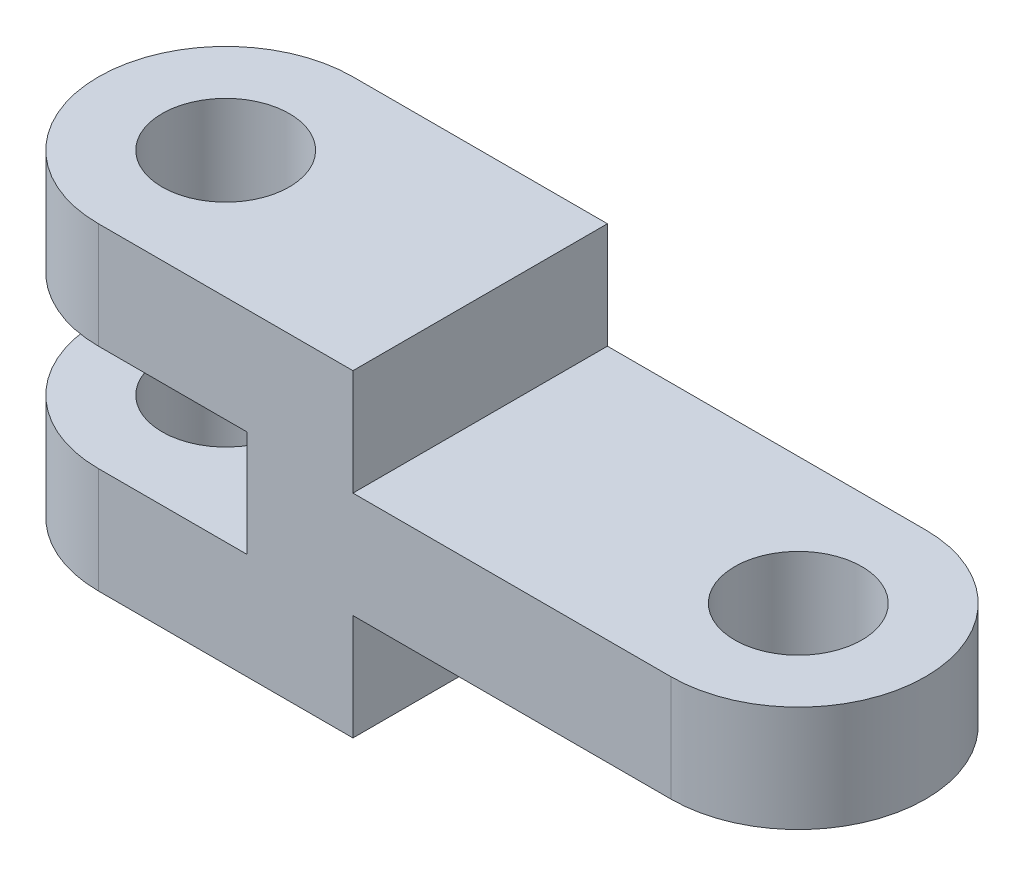
ISO-10303-21;
HEADER;
FILE_DESCRIPTION(('STEP AP214'),'2;1');
FILE_NAME('part.step','',(''),(''),'','','');
FILE_SCHEMA(('AUTOMOTIVE_DESIGN { 1 0 10303 214 1 1 1 1 }'));
ENDSEC;
DATA;
#1=APPLICATION_CONTEXT('core data for automotive mechanical design processes');
#2=APPLICATION_PROTOCOL_DEFINITION('international standard','automotive_design',2000,#1);
#3=PRODUCT_CONTEXT('',#1,'mechanical');
#4=PRODUCT('Part','Part','',(#3));
#5=PRODUCT_RELATED_PRODUCT_CATEGORY('part','',(#4));
#6=PRODUCT_DEFINITION_FORMATION('','',#4);
#7=PRODUCT_DEFINITION_CONTEXT('part definition',#1,'design');
#8=PRODUCT_DEFINITION('design','',#6,#7);
#9=PRODUCT_DEFINITION_SHAPE('','',#8);
#10=(LENGTH_UNIT() NAMED_UNIT(*) SI_UNIT(.MILLI.,.METRE.));
#11=(NAMED_UNIT(*) PLANE_ANGLE_UNIT() SI_UNIT($,.RADIAN.));
#12=(NAMED_UNIT(*) SI_UNIT($,.STERADIAN.) SOLID_ANGLE_UNIT());
#13=UNCERTAINTY_MEASURE_WITH_UNIT(LENGTH_MEASURE(1.E-05),#10,'distance_accuracy_value','');
#14=(GEOMETRIC_REPRESENTATION_CONTEXT(3) GLOBAL_UNCERTAINTY_ASSIGNED_CONTEXT((#13)) GLOBAL_UNIT_ASSIGNED_CONTEXT((#10,
#11,#12)) REPRESENTATION_CONTEXT('',''));
#15=CARTESIAN_POINT('',(0.,0.,0.));
#16=DIRECTION('',(0.,0.,1.));
#17=DIRECTION('',(1.,0.,0.));
#18=AXIS2_PLACEMENT_3D('',#15,#16,#17);
#19=CARTESIAN_POINT('',(35.,-25.,60.));
#20=DIRECTION('',(0.,1.,0.));
#21=DIRECTION('',(0.,0.,1.));
#22=AXIS2_PLACEMENT_3D('',#19,#20,#21);
#23=PLANE('',#22);
#24=CARTESIAN_POINT('',(0.,-25.,30.));
#25=DIRECTION('',(0.,1.,0.));
#26=DIRECTION('',(0.,0.,1.));
#27=AXIS2_PLACEMENT_3D('',#24,#25,#26);
#28=CIRCLE('',#27,15.);
#29=CARTESIAN_POINT('',(0.,-25.,45.));
#30=VERTEX_POINT('',#29);
#31=EDGE_CURVE('E249',#30,#30,#28,.T.);
#32=ORIENTED_EDGE('',*,*,#31,.T.);
#33=EDGE_LOOP('',(#32));
#34=FACE_BOUND('',#33,.T.);
#35=DIRECTION('',(1.,0.,0.));
#36=VECTOR('',#35,1.);
#37=CARTESIAN_POINT('',(35.,-25.,0.));
#38=LINE('',#37,#36);
#39=CARTESIAN_POINT('',(0.,-25.,0.));
#40=VERTEX_POINT('',#39);
#41=CARTESIAN_POINT('',(35.,-25.,0.));
#42=VERTEX_POINT('',#41);
#43=EDGE_CURVE('E159',#40,#42,#38,.T.);
#44=ORIENTED_EDGE('',*,*,#43,.T.);
#45=DIRECTION('',(0.,0.,-1.));
#46=VECTOR('',#45,1.);
#47=CARTESIAN_POINT('',(35.,-25.,60.));
#48=LINE('',#47,#46);
#49=CARTESIAN_POINT('',(35.,-25.,60.));
#50=VERTEX_POINT('',#49);
#51=EDGE_CURVE('E11',#50,#42,#48,.T.);
#52=ORIENTED_EDGE('',*,*,#51,.F.);
#53=DIRECTION('',(1.,0.,0.));
#54=VECTOR('',#53,1.);
#55=CARTESIAN_POINT('',(35.,-25.,60.));
#56=LINE('',#55,#54);
#57=CARTESIAN_POINT('',(0.,-25.,60.));
#58=VERTEX_POINT('',#57);
#59=EDGE_CURVE('E106',#58,#50,#56,.T.);
#60=ORIENTED_EDGE('',*,*,#59,.F.);
#61=CARTESIAN_POINT('',(0.,-25.,30.));
#62=DIRECTION('',(0.,1.,0.));
#63=DIRECTION('',(0.,0.,1.));
#64=AXIS2_PLACEMENT_3D('',#61,#62,#63);
#65=CIRCLE('',#64,30.);
#66=EDGE_CURVE('E160',#40,#58,#65,.T.);
#67=ORIENTED_EDGE('',*,*,#66,.F.);
#68=EDGE_LOOP('',(#44,#52,#60,#67));
#69=FACE_BOUND('',#68,.T.);
#70=ADVANCED_FACE('F41',(#34,#69),#23,.F.);
#71=CARTESIAN_POINT('',(35.,-50.,60.));
#72=DIRECTION('',(1.,0.,0.));
#73=DIRECTION('',(0.,1.,0.));
#74=AXIS2_PLACEMENT_3D('',#71,#72,#73);
#75=PLANE('',#74);
#76=DIRECTION('',(0.,-1.,0.));
#77=VECTOR('',#76,1.);
#78=CARTESIAN_POINT('',(35.,-50.,0.));
#79=LINE('',#78,#77);
#80=CARTESIAN_POINT('',(35.,-50.,0.));
#81=VERTEX_POINT('',#80);
#82=EDGE_CURVE('E162',#42,#81,#79,.T.);
#83=ORIENTED_EDGE('',*,*,#82,.T.);
#84=DIRECTION('',(0.,0.,-1.));
#85=VECTOR('',#84,1.);
#86=CARTESIAN_POINT('',(35.,-50.,60.));
#87=LINE('',#86,#85);
#88=CARTESIAN_POINT('',(35.,-50.,60.));
#89=VERTEX_POINT('',#88);
#90=EDGE_CURVE('E49',#89,#81,#87,.T.);
#91=ORIENTED_EDGE('',*,*,#90,.F.);
#92=DIRECTION('',(0.,-1.,0.));
#93=VECTOR('',#92,1.);
#94=CARTESIAN_POINT('',(35.,-50.,60.));
#95=LINE('',#94,#93);
#96=EDGE_CURVE('E228',#50,#89,#95,.T.);
#97=ORIENTED_EDGE('',*,*,#96,.F.);
#98=ORIENTED_EDGE('',*,*,#51,.T.);
#99=EDGE_LOOP('',(#83,#91,#97,#98));
#100=FACE_BOUND('',#99,.T.);
#101=ADVANCED_FACE('F284',(#100),#75,.F.);
#102=CARTESIAN_POINT('',(0.,-50.,60.));
#103=DIRECTION('',(0.,-1.,0.));
#104=DIRECTION('',(1.,0.,0.));
#105=AXIS2_PLACEMENT_3D('',#102,#103,#104);
#106=PLANE('',#105);
#107=CARTESIAN_POINT('',(0.,-50.,30.));
#108=DIRECTION('',(0.,-1.,0.));
#109=DIRECTION('',(1.,0.,0.));
#110=AXIS2_PLACEMENT_3D('',#107,#108,#109);
#111=CIRCLE('',#110,15.);
#112=CARTESIAN_POINT('',(15.,-50.,30.));
#113=VERTEX_POINT('',#112);
#114=EDGE_CURVE('E251',#113,#113,#111,.T.);
#115=ORIENTED_EDGE('',*,*,#114,.T.);
#116=EDGE_LOOP('',(#115));
#117=FACE_BOUND('',#116,.T.);
#118=DIRECTION('',(-1.,0.,0.));
#119=VECTOR('',#118,1.);
#120=CARTESIAN_POINT('',(0.,-50.,0.));
#121=LINE('',#120,#119);
#122=CARTESIAN_POINT('',(0.,-50.,0.));
#123=VERTEX_POINT('',#122);
#124=EDGE_CURVE('E164',#81,#123,#121,.T.);
#125=ORIENTED_EDGE('',*,*,#124,.T.);
#126=CARTESIAN_POINT('',(0.,-50.,30.));
#127=DIRECTION('',(0.,1.,0.));
#128=DIRECTION('',(-1.,0.,0.));
#129=AXIS2_PLACEMENT_3D('',#126,#127,#128);
#130=CIRCLE('',#129,30.);
#131=CARTESIAN_POINT('',(0.,-50.,60.));
#132=VERTEX_POINT('',#131);
#133=EDGE_CURVE('E210',#123,#132,#130,.T.);
#134=ORIENTED_EDGE('',*,*,#133,.T.);
#135=DIRECTION('',(-1.,0.,0.));
#136=VECTOR('',#135,1.);
#137=CARTESIAN_POINT('',(0.,-50.,60.));
#138=LINE('',#137,#136);
#139=EDGE_CURVE('E195',#89,#132,#138,.T.);
#140=ORIENTED_EDGE('',*,*,#139,.F.);
#141=ORIENTED_EDGE('',*,*,#90,.T.);
#142=EDGE_LOOP('',(#125,#134,#140,#141));
#143=FACE_BOUND('',#142,.T.);
#144=ADVANCED_FACE('F192',(#117,#143),#106,.F.);
#145=CARTESIAN_POINT('',(60.,-75.,60.));
#146=DIRECTION('',(0.,1.,0.));
#147=DIRECTION('',(-1.,0.,0.));
#148=AXIS2_PLACEMENT_3D('',#145,#146,#147);
#149=PLANE('',#148);
#150=CARTESIAN_POINT('',(0.,-75.,30.));
#151=DIRECTION('',(0.,1.,0.));
#152=DIRECTION('',(0.,0.,1.));
#153=AXIS2_PLACEMENT_3D('',#150,#151,#152);
#154=CIRCLE('',#153,15.);
#155=CARTESIAN_POINT('',(0.,-75.,45.));
#156=VERTEX_POINT('',#155);
#157=EDGE_CURVE('E256',#156,#156,#154,.T.);
#158=ORIENTED_EDGE('',*,*,#157,.T.);
#159=EDGE_LOOP('',(#158));
#160=FACE_BOUND('',#159,.T.);
#161=DIRECTION('',(1.,0.,0.));
#162=VECTOR('',#161,1.);
#163=CARTESIAN_POINT('',(60.,-75.,0.));
#164=LINE('',#163,#162);
#165=CARTESIAN_POINT('',(0.,-75.,0.));
#166=VERTEX_POINT('',#165);
#167=CARTESIAN_POINT('',(60.,-75.,0.));
#168=VERTEX_POINT('',#167);
#169=EDGE_CURVE('E169',#166,#168,#164,.T.);
#170=ORIENTED_EDGE('',*,*,#169,.T.);
#171=DIRECTION('',(0.,0.,-1.));
#172=VECTOR('',#171,1.);
#173=CARTESIAN_POINT('',(60.,-75.,60.));
#174=LINE('',#173,#172);
#175=CARTESIAN_POINT('',(60.,-75.,60.));
#176=VERTEX_POINT('',#175);
#177=EDGE_CURVE('E185',#176,#168,#174,.T.);
#178=ORIENTED_EDGE('',*,*,#177,.F.);
#179=DIRECTION('',(1.,0.,0.));
#180=VECTOR('',#179,1.);
#181=CARTESIAN_POINT('',(60.,-75.,60.));
#182=LINE('',#181,#180);
#183=CARTESIAN_POINT('',(0.,-75.,60.));
#184=VERTEX_POINT('',#183);
#185=EDGE_CURVE('E232',#184,#176,#182,.T.);
#186=ORIENTED_EDGE('',*,*,#185,.F.);
#187=CARTESIAN_POINT('',(0.,-75.,30.));
#188=DIRECTION('',(0.,1.,0.));
#189=DIRECTION('',(-1.,0.,0.));
#190=AXIS2_PLACEMENT_3D('',#187,#188,#189);
#191=CIRCLE('',#190,30.);
#192=EDGE_CURVE('E213',#166,#184,#191,.T.);
#193=ORIENTED_EDGE('',*,*,#192,.F.);
#194=EDGE_LOOP('',(#170,#178,#186,#193));
#195=FACE_BOUND('',#194,.T.);
#196=ADVANCED_FACE('F327',(#160,#195),#149,.F.);
#197=CARTESIAN_POINT('',(60.,-50.,60.));
#198=DIRECTION('',(-1.,0.,0.));
#199=DIRECTION('',(0.,0.,1.));
#200=AXIS2_PLACEMENT_3D('',#197,#198,#199);
#201=PLANE('',#200);
#202=DIRECTION('',(0.,1.,0.));
#203=VECTOR('',#202,1.);
#204=CARTESIAN_POINT('',(60.,-50.,0.));
#205=LINE('',#204,#203);
#206=CARTESIAN_POINT('',(60.,-50.,0.));
#207=VERTEX_POINT('',#206);
#208=EDGE_CURVE('E171',#168,#207,#205,.T.);
#209=ORIENTED_EDGE('',*,*,#208,.T.);
#210=DIRECTION('',(0.,0.,-1.));
#211=VECTOR('',#210,1.);
#212=CARTESIAN_POINT('',(60.,-50.,60.));
#213=LINE('',#212,#211);
#214=CARTESIAN_POINT('',(60.,-50.,60.));
#215=VERTEX_POINT('',#214);
#216=EDGE_CURVE('E148',#215,#207,#213,.T.);
#217=ORIENTED_EDGE('',*,*,#216,.F.);
#218=DIRECTION('',(0.,1.,0.));
#219=VECTOR('',#218,1.);
#220=CARTESIAN_POINT('',(60.,-50.,60.));
#221=LINE('',#220,#219);
#222=EDGE_CURVE('E234',#176,#215,#221,.T.);
#223=ORIENTED_EDGE('',*,*,#222,.F.);
#224=ORIENTED_EDGE('',*,*,#177,.T.);
#225=EDGE_LOOP('',(#209,#217,#223,#224));
#226=FACE_BOUND('',#225,.T.);
#227=ADVANCED_FACE('F280',(#226),#201,.F.);
#228=CARTESIAN_POINT('',(135.,-50.,60.));
#229=DIRECTION('',(0.,1.,0.));
#230=DIRECTION('',(-1.,0.,0.));
#231=AXIS2_PLACEMENT_3D('',#228,#229,#230);
#232=PLANE('',#231);
#233=CARTESIAN_POINT('',(135.,-50.,30.));
#234=DIRECTION('',(0.,1.,0.));
#235=DIRECTION('',(-1.,0.,0.));
#236=AXIS2_PLACEMENT_3D('',#233,#234,#235);
#237=CIRCLE('',#236,15.);
#238=CARTESIAN_POINT('',(120.,-50.,30.));
#239=VERTEX_POINT('',#238);
#240=EDGE_CURVE('E260',#239,#239,#237,.T.);
#241=ORIENTED_EDGE('',*,*,#240,.T.);
#242=EDGE_LOOP('',(#241));
#243=FACE_BOUND('',#242,.T.);
#244=DIRECTION('',(1.,0.,0.));
#245=VECTOR('',#244,1.);
#246=CARTESIAN_POINT('',(135.,-50.,0.));
#247=LINE('',#246,#245);
#248=CARTESIAN_POINT('',(135.,-50.,0.));
#249=VERTEX_POINT('',#248);
#250=EDGE_CURVE('E173',#207,#249,#247,.T.);
#251=ORIENTED_EDGE('',*,*,#250,.T.);
#252=CARTESIAN_POINT('',(135.,-50.,30.));
#253=DIRECTION('',(0.,1.,0.));
#254=DIRECTION('',(1.,0.,0.));
#255=AXIS2_PLACEMENT_3D('',#252,#253,#254);
#256=CIRCLE('',#255,30.);
#257=CARTESIAN_POINT('',(135.,-50.,60.));
#258=VERTEX_POINT('',#257);
#259=EDGE_CURVE('E214',#258,#249,#256,.T.);
#260=ORIENTED_EDGE('',*,*,#259,.F.);
#261=DIRECTION('',(1.,0.,0.));
#262=VECTOR('',#261,1.);
#263=CARTESIAN_POINT('',(135.,-50.,60.));
#264=LINE('',#263,#262);
#265=EDGE_CURVE('E236',#215,#258,#264,.T.);
#266=ORIENTED_EDGE('',*,*,#265,.F.);
#267=ORIENTED_EDGE('',*,*,#216,.T.);
#268=EDGE_LOOP('',(#251,#260,#266,#267));
#269=FACE_BOUND('',#268,.T.);
#270=ADVANCED_FACE('F244',(#243,#269),#232,.F.);
#271=CARTESIAN_POINT('',(60.,-25.,60.));
#272=DIRECTION('',(0.,-1.,0.));
#273=DIRECTION('',(1.,0.,0.));
#274=AXIS2_PLACEMENT_3D('',#271,#272,#273);
#275=PLANE('',#274);
#276=CARTESIAN_POINT('',(135.,-25.,30.));
#277=DIRECTION('',(0.,1.,0.));
#278=DIRECTION('',(-1.,0.,0.));
#279=AXIS2_PLACEMENT_3D('',#276,#277,#278);
#280=CIRCLE('',#279,15.);
#281=CARTESIAN_POINT('',(120.,-25.,30.));
#282=VERTEX_POINT('',#281);
#283=EDGE_CURVE('E265',#282,#282,#280,.T.);
#284=ORIENTED_EDGE('',*,*,#283,.F.);
#285=EDGE_LOOP('',(#284));
#286=FACE_BOUND('',#285,.T.);
#287=DIRECTION('',(-1.,0.,0.));
#288=VECTOR('',#287,1.);
#289=CARTESIAN_POINT('',(60.,-25.,0.));
#290=LINE('',#289,#288);
#291=CARTESIAN_POINT('',(135.,-25.,0.));
#292=VERTEX_POINT('',#291);
#293=CARTESIAN_POINT('',(60.,-25.,0.));
#294=VERTEX_POINT('',#293);
#295=EDGE_CURVE('E147',#292,#294,#290,.T.);
#296=ORIENTED_EDGE('',*,*,#295,.T.);
#297=DIRECTION('',(0.,0.,-1.));
#298=VECTOR('',#297,1.);
#299=CARTESIAN_POINT('',(60.,-25.,60.));
#300=LINE('',#299,#298);
#301=CARTESIAN_POINT('',(60.,-25.,60.));
#302=VERTEX_POINT('',#301);
#303=EDGE_CURVE('E144',#302,#294,#300,.T.);
#304=ORIENTED_EDGE('',*,*,#303,.F.);
#305=DIRECTION('',(-1.,0.,0.));
#306=VECTOR('',#305,1.);
#307=CARTESIAN_POINT('',(60.,-25.,60.));
#308=LINE('',#307,#306);
#309=CARTESIAN_POINT('',(135.,-25.,60.));
#310=VERTEX_POINT('',#309);
#311=EDGE_CURVE('E133',#310,#302,#308,.T.);
#312=ORIENTED_EDGE('',*,*,#311,.F.);
#313=CARTESIAN_POINT('',(135.,-25.,30.));
#314=DIRECTION('',(0.,1.,0.));
#315=DIRECTION('',(1.,0.,0.));
#316=AXIS2_PLACEMENT_3D('',#313,#314,#315);
#317=CIRCLE('',#316,30.);
#318=EDGE_CURVE('E219',#310,#292,#317,.T.);
#319=ORIENTED_EDGE('',*,*,#318,.T.);
#320=EDGE_LOOP('',(#296,#304,#312,#319));
#321=FACE_BOUND('',#320,.T.);
#322=ADVANCED_FACE('F145',(#286,#321),#275,.F.);
#323=CARTESIAN_POINT('',(60.,0.,60.));
#324=DIRECTION('',(-1.,0.,0.));
#325=DIRECTION('',(0.,0.,1.));
#326=AXIS2_PLACEMENT_3D('',#323,#324,#325);
#327=PLANE('',#326);
#328=DIRECTION('',(0.,1.,0.));
#329=VECTOR('',#328,1.);
#330=CARTESIAN_POINT('',(60.,0.,0.));
#331=LINE('',#330,#329);
#332=CARTESIAN_POINT('',(60.,0.,0.));
#333=VERTEX_POINT('',#332);
#334=EDGE_CURVE('E90',#294,#333,#331,.T.);
#335=ORIENTED_EDGE('',*,*,#334,.T.);
#336=DIRECTION('',(0.,0.,-1.));
#337=VECTOR('',#336,1.);
#338=CARTESIAN_POINT('',(60.,0.,60.));
#339=LINE('',#338,#337);
#340=CARTESIAN_POINT('',(60.,0.,60.));
#341=VERTEX_POINT('',#340);
#342=EDGE_CURVE('E149',#341,#333,#339,.T.);
#343=ORIENTED_EDGE('',*,*,#342,.F.);
#344=DIRECTION('',(0.,1.,0.));
#345=VECTOR('',#344,1.);
#346=CARTESIAN_POINT('',(60.,0.,60.));
#347=LINE('',#346,#345);
#348=EDGE_CURVE('E137',#302,#341,#347,.T.);
#349=ORIENTED_EDGE('',*,*,#348,.F.);
#350=ORIENTED_EDGE('',*,*,#303,.T.);
#351=EDGE_LOOP('',(#335,#343,#349,#350));
#352=FACE_BOUND('',#351,.T.);
#353=ADVANCED_FACE('F151',(#352),#327,.F.);
#354=CARTESIAN_POINT('',(0.,0.,60.));
#355=DIRECTION('',(0.,-1.,0.));
#356=DIRECTION('',(0.,0.,-1.));
#357=AXIS2_PLACEMENT_3D('',#354,#355,#356);
#358=PLANE('',#357);
#359=CARTESIAN_POINT('',(0.,0.,30.));
#360=DIRECTION('',(0.,1.,0.));
#361=DIRECTION('',(0.,0.,1.));
#362=AXIS2_PLACEMENT_3D('',#359,#360,#361);
#363=CIRCLE('',#362,15.);
#364=CARTESIAN_POINT('',(0.,0.,45.));
#365=VERTEX_POINT('',#364);
#366=EDGE_CURVE('E257',#365,#365,#363,.T.);
#367=ORIENTED_EDGE('',*,*,#366,.F.);
#368=EDGE_LOOP('',(#367));
#369=FACE_BOUND('',#368,.T.);
#370=DIRECTION('',(-1.,0.,0.));
#371=VECTOR('',#370,1.);
#372=CARTESIAN_POINT('',(0.,0.,0.));
#373=LINE('',#372,#371);
#374=CARTESIAN_POINT('',(0.,0.,0.));
#375=VERTEX_POINT('',#374);
#376=EDGE_CURVE('E97',#333,#375,#373,.T.);
#377=ORIENTED_EDGE('',*,*,#376,.T.);
#378=CARTESIAN_POINT('',(0.,0.,30.));
#379=DIRECTION('',(0.,1.,0.));
#380=DIRECTION('',(0.,0.,1.));
#381=AXIS2_PLACEMENT_3D('',#378,#379,#380);
#382=CIRCLE('',#381,30.);
#383=CARTESIAN_POINT('',(0.,0.,60.));
#384=VERTEX_POINT('',#383);
#385=EDGE_CURVE('E216',#375,#384,#382,.T.);
#386=ORIENTED_EDGE('',*,*,#385,.T.);
#387=DIRECTION('',(-1.,0.,0.));
#388=VECTOR('',#387,1.);
#389=CARTESIAN_POINT('',(0.,0.,60.));
#390=LINE('',#389,#388);
#391=EDGE_CURVE('E57',#341,#384,#390,.T.);
#392=ORIENTED_EDGE('',*,*,#391,.F.);
#393=ORIENTED_EDGE('',*,*,#342,.T.);
#394=EDGE_LOOP('',(#377,#386,#392,#393));
#395=FACE_BOUND('',#394,.T.);
#396=ADVANCED_FACE('F278',(#369,#395),#358,.F.);
#397=CARTESIAN_POINT('',(0.,0.,60.));
#398=DIRECTION('',(0.,0.,-1.));
#399=DIRECTION('',(-1.,0.,0.));
#400=AXIS2_PLACEMENT_3D('',#397,#398,#399);
#401=PLANE('',#400);
#402=DIRECTION('',(0.,-1.,0.));
#403=VECTOR('',#402,1.);
#404=CARTESIAN_POINT('',(0.,-25.,60.));
#405=LINE('',#404,#403);
#406=EDGE_CURVE('E181',#384,#58,#405,.T.);
#407=ORIENTED_EDGE('',*,*,#406,.T.);
#408=ORIENTED_EDGE('',*,*,#59,.T.);
#409=ORIENTED_EDGE('',*,*,#96,.T.);
#410=ORIENTED_EDGE('',*,*,#139,.T.);
#411=DIRECTION('',(0.,-1.,0.));
#412=VECTOR('',#411,1.);
#413=CARTESIAN_POINT('',(0.,-75.,60.));
#414=LINE('',#413,#412);
#415=EDGE_CURVE('E212',#132,#184,#414,.T.);
#416=ORIENTED_EDGE('',*,*,#415,.T.);
#417=ORIENTED_EDGE('',*,*,#185,.T.);
#418=ORIENTED_EDGE('',*,*,#222,.T.);
#419=ORIENTED_EDGE('',*,*,#265,.T.);
#420=DIRECTION('',(0.,1.,0.));
#421=VECTOR('',#420,1.);
#422=CARTESIAN_POINT('',(135.,-25.,60.));
#423=LINE('',#422,#421);
#424=EDGE_CURVE('E139',#258,#310,#423,.T.);
#425=ORIENTED_EDGE('',*,*,#424,.T.);
#426=ORIENTED_EDGE('',*,*,#311,.T.);
#427=ORIENTED_EDGE('',*,*,#348,.T.);
#428=ORIENTED_EDGE('',*,*,#391,.T.);
#429=EDGE_LOOP('',(#407,#408,#409,#410,#416,#417,#418,#419,#425,#426,#427,#428));
#430=FACE_BOUND('',#429,.T.);
#431=ADVANCED_FACE('F135',(#430),#401,.F.);
#432=CARTESIAN_POINT('',(0.,0.,0.));
#433=DIRECTION('',(0.,0.,-1.));
#434=DIRECTION('',(-1.,0.,0.));
#435=AXIS2_PLACEMENT_3D('',#432,#433,#434);
#436=PLANE('',#435);
#437=DIRECTION('',(0.,-1.,0.));
#438=VECTOR('',#437,1.);
#439=CARTESIAN_POINT('',(0.,-25.,0.));
#440=LINE('',#439,#438);
#441=EDGE_CURVE('E156',#375,#40,#440,.T.);
#442=ORIENTED_EDGE('',*,*,#441,.F.);
#443=ORIENTED_EDGE('',*,*,#376,.F.);
#444=ORIENTED_EDGE('',*,*,#334,.F.);
#445=ORIENTED_EDGE('',*,*,#295,.F.);
#446=DIRECTION('',(0.,1.,0.));
#447=VECTOR('',#446,1.);
#448=CARTESIAN_POINT('',(135.,-25.,0.));
#449=LINE('',#448,#447);
#450=EDGE_CURVE('E175',#249,#292,#449,.T.);
#451=ORIENTED_EDGE('',*,*,#450,.F.);
#452=ORIENTED_EDGE('',*,*,#250,.F.);
#453=ORIENTED_EDGE('',*,*,#208,.F.);
#454=ORIENTED_EDGE('',*,*,#169,.F.);
#455=DIRECTION('',(0.,-1.,0.));
#456=VECTOR('',#455,1.);
#457=CARTESIAN_POINT('',(0.,-75.,0.));
#458=LINE('',#457,#456);
#459=EDGE_CURVE('E166',#123,#166,#458,.T.);
#460=ORIENTED_EDGE('',*,*,#459,.F.);
#461=ORIENTED_EDGE('',*,*,#124,.F.);
#462=ORIENTED_EDGE('',*,*,#82,.F.);
#463=ORIENTED_EDGE('',*,*,#43,.F.);
#464=EDGE_LOOP('',(#442,#443,#444,#445,#451,#452,#453,#454,#460,#461,#462,#463));
#465=FACE_BOUND('',#464,.T.);
#466=ADVANCED_FACE('F200',(#465),#436,.T.);
#467=CARTESIAN_POINT('',(0.,-25.,30.));
#468=DIRECTION('',(0.,1.,0.));
#469=DIRECTION('',(0.,0.,1.));
#470=AXIS2_PLACEMENT_3D('',#467,#468,#469);
#471=CYLINDRICAL_SURFACE('',#470,30.);
#472=ORIENTED_EDGE('',*,*,#385,.F.);
#473=ORIENTED_EDGE('',*,*,#441,.T.);
#474=ORIENTED_EDGE('',*,*,#66,.T.);
#475=ORIENTED_EDGE('',*,*,#406,.F.);
#476=EDGE_LOOP('',(#472,#473,#474,#475));
#477=FACE_BOUND('',#476,.T.);
#478=ADVANCED_FACE('F292',(#477),#471,.T.);
#479=CARTESIAN_POINT('',(0.,-75.,30.));
#480=DIRECTION('',(0.,1.,0.));
#481=DIRECTION('',(-1.,0.,0.));
#482=AXIS2_PLACEMENT_3D('',#479,#480,#481);
#483=CYLINDRICAL_SURFACE('',#482,30.);
#484=ORIENTED_EDGE('',*,*,#133,.F.);
#485=ORIENTED_EDGE('',*,*,#459,.T.);
#486=ORIENTED_EDGE('',*,*,#192,.T.);
#487=ORIENTED_EDGE('',*,*,#415,.F.);
#488=EDGE_LOOP('',(#484,#485,#486,#487));
#489=FACE_BOUND('',#488,.T.);
#490=ADVANCED_FACE('F211',(#489),#483,.T.);
#491=CARTESIAN_POINT('',(135.,-50.,30.));
#492=DIRECTION('',(0.,1.,0.));
#493=DIRECTION('',(-1.,0.,0.));
#494=AXIS2_PLACEMENT_3D('',#491,#492,#493);
#495=CYLINDRICAL_SURFACE('',#494,30.);
#496=ORIENTED_EDGE('',*,*,#318,.F.);
#497=ORIENTED_EDGE('',*,*,#424,.F.);
#498=ORIENTED_EDGE('',*,*,#259,.T.);
#499=ORIENTED_EDGE('',*,*,#450,.T.);
#500=EDGE_LOOP('',(#496,#497,#498,#499));
#501=FACE_BOUND('',#500,.T.);
#502=ADVANCED_FACE('F243',(#501),#495,.T.);
#503=CARTESIAN_POINT('',(0.,-75.,30.));
#504=DIRECTION('',(0.,1.,0.));
#505=DIRECTION('',(0.,0.,1.));
#506=AXIS2_PLACEMENT_3D('',#503,#504,#505);
#507=CYLINDRICAL_SURFACE('',#506,15.);
#508=ORIENTED_EDGE('',*,*,#366,.T.);
#509=EDGE_LOOP('',(#508));
#510=FACE_BOUND('',#509,.T.);
#511=ORIENTED_EDGE('',*,*,#31,.F.);
#512=EDGE_LOOP('',(#511));
#513=FACE_BOUND('',#512,.T.);
#514=ADVANCED_FACE('F310',(#510,#513),#507,.F.);
#515=ORIENTED_EDGE('',*,*,#157,.F.);
#516=EDGE_LOOP('',(#515));
#517=FACE_BOUND('',#516,.T.);
#518=ORIENTED_EDGE('',*,*,#114,.F.);
#519=EDGE_LOOP('',(#518));
#520=FACE_BOUND('',#519,.T.);
#521=ADVANCED_FACE('F313',(#517,#520),#507,.F.);
#522=CARTESIAN_POINT('',(135.,-75.,30.));
#523=DIRECTION('',(0.,1.,0.));
#524=DIRECTION('',(-1.,0.,0.));
#525=AXIS2_PLACEMENT_3D('',#522,#523,#524);
#526=CYLINDRICAL_SURFACE('',#525,15.);
#527=ORIENTED_EDGE('',*,*,#283,.T.);
#528=EDGE_LOOP('',(#527));
#529=FACE_BOUND('',#528,.T.);
#530=ORIENTED_EDGE('',*,*,#240,.F.);
#531=EDGE_LOOP('',(#530));
#532=FACE_BOUND('',#531,.T.);
#533=ADVANCED_FACE('F269',(#529,#532),#526,.F.);
#534=CLOSED_SHELL('',(#70,#101,#144,#196,#227,#270,#322,#353,#396,#431,#466,#478,#490,#502,#514,
#521,#533));
#535=MANIFOLD_SOLID_BREP('B2',#534);
#536=ADVANCED_BREP_SHAPE_REPRESENTATION('',(#18,#535),#14);
#537=SHAPE_DEFINITION_REPRESENTATION(#9,#536);
ENDSEC;
END-ISO-10303-21;
